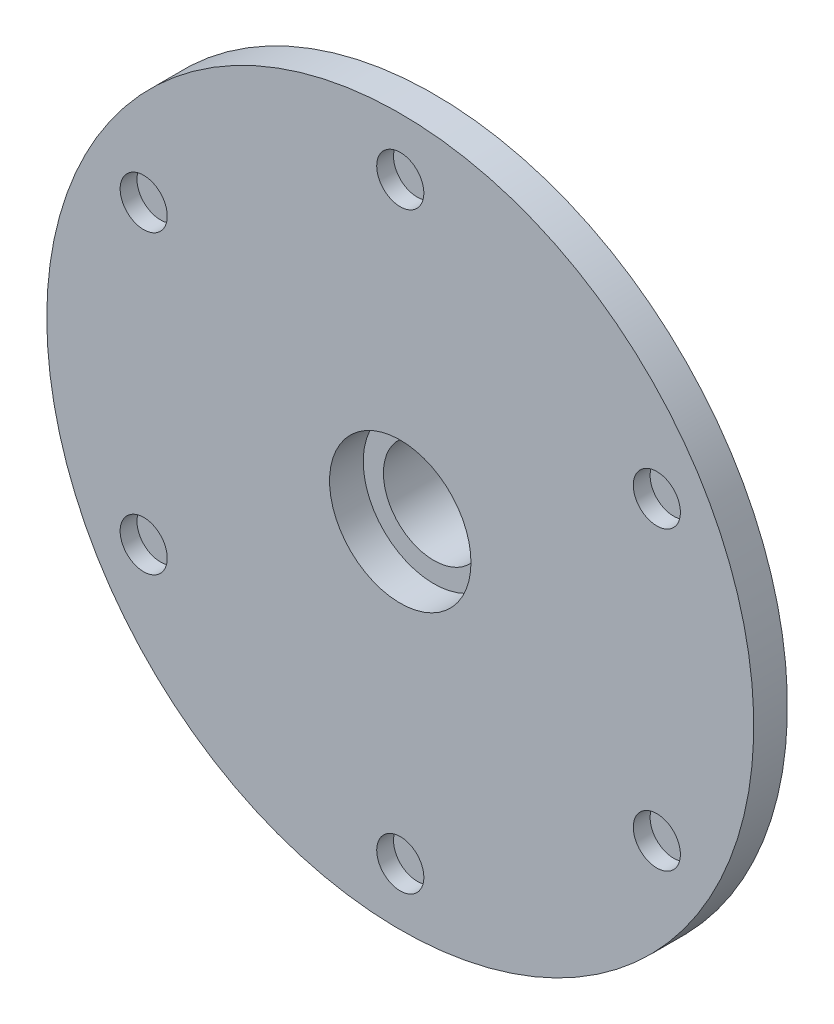
ISO-10303-21;
HEADER;
FILE_DESCRIPTION(('STEP AP214'),'2;1');
FILE_NAME('part.step','',(''),(''),'','','');
FILE_SCHEMA(('AUTOMOTIVE_DESIGN { 1 0 10303 214 1 1 1 1 }'));
ENDSEC;
DATA;
#1=APPLICATION_CONTEXT('core data for automotive mechanical design processes');
#2=APPLICATION_PROTOCOL_DEFINITION('international standard','automotive_design',2000,#1);
#3=PRODUCT_CONTEXT('',#1,'mechanical');
#4=PRODUCT('Part','Part','',(#3));
#5=PRODUCT_RELATED_PRODUCT_CATEGORY('part','',(#4));
#6=PRODUCT_DEFINITION_FORMATION('','',#4);
#7=PRODUCT_DEFINITION_CONTEXT('part definition',#1,'design');
#8=PRODUCT_DEFINITION('design','',#6,#7);
#9=PRODUCT_DEFINITION_SHAPE('','',#8);
#10=(LENGTH_UNIT() NAMED_UNIT(*) SI_UNIT(.MILLI.,.METRE.));
#11=(NAMED_UNIT(*) PLANE_ANGLE_UNIT() SI_UNIT($,.RADIAN.));
#12=(NAMED_UNIT(*) SI_UNIT($,.STERADIAN.) SOLID_ANGLE_UNIT());
#13=UNCERTAINTY_MEASURE_WITH_UNIT(LENGTH_MEASURE(1.E-05),#10,'distance_accuracy_value','');
#14=(GEOMETRIC_REPRESENTATION_CONTEXT(3) GLOBAL_UNCERTAINTY_ASSIGNED_CONTEXT((#13)) GLOBAL_UNIT_ASSIGNED_CONTEXT((#10,
#11,#12)) REPRESENTATION_CONTEXT('',''));
#15=CARTESIAN_POINT('',(0.,0.,0.));
#16=DIRECTION('',(0.,0.,1.));
#17=DIRECTION('',(1.,0.,0.));
#18=AXIS2_PLACEMENT_3D('',#15,#16,#17);
#19=CARTESIAN_POINT('',(0.,0.,13.));
#20=DIRECTION('',(0.,0.,-1.));
#21=DIRECTION('',(-1.,0.,0.));
#22=AXIS2_PLACEMENT_3D('',#19,#20,#21);
#23=CYLINDRICAL_SURFACE('',#22,7.5);
#24=CARTESIAN_POINT('',(0.,0.,-7.));
#25=DIRECTION('',(0.,0.,-1.));
#26=DIRECTION('',(-1.,0.,0.));
#27=AXIS2_PLACEMENT_3D('',#24,#25,#26);
#28=CIRCLE('',#27,7.5);
#29=CARTESIAN_POINT('',(-7.5,0.,-7.));
#30=VERTEX_POINT('',#29);
#31=EDGE_CURVE('E55',#30,#30,#28,.T.);
#32=ORIENTED_EDGE('',*,*,#31,.T.);
#33=EDGE_LOOP('',(#32));
#34=FACE_BOUND('',#33,.T.);
#35=CARTESIAN_POINT('',(0.,0.,8.));
#36=DIRECTION('',(0.,0.,1.));
#37=DIRECTION('',(1.,0.,0.));
#38=AXIS2_PLACEMENT_3D('',#35,#36,#37);
#39=CIRCLE('',#38,7.5);
#40=CARTESIAN_POINT('',(7.5,0.,8.));
#41=VERTEX_POINT('',#40);
#42=EDGE_CURVE('E35',#41,#41,#39,.F.);
#43=ORIENTED_EDGE('',*,*,#42,.F.);
#44=EDGE_LOOP('',(#43));
#45=FACE_BOUND('',#44,.T.);
#46=ADVANCED_FACE('F31',(#34,#45),#23,.F.);
#47=CARTESIAN_POINT('',(0.,0.,0.));
#48=DIRECTION('',(0.,0.,1.));
#49=DIRECTION('',(1.,0.,0.));
#50=AXIS2_PLACEMENT_3D('',#47,#48,#49);
#51=PLANE('',#50);
#52=CARTESIAN_POINT('',(0.,0.,0.));
#53=DIRECTION('',(0.,0.,-1.));
#54=DIRECTION('',(-1.,0.,0.));
#55=AXIS2_PLACEMENT_3D('',#52,#53,#54);
#56=CIRCLE('',#55,17.5);
#57=CARTESIAN_POINT('',(-17.5,0.,0.));
#58=VERTEX_POINT('',#57);
#59=EDGE_CURVE('E10',#58,#58,#56,.T.);
#60=ORIENTED_EDGE('',*,*,#59,.F.);
#61=EDGE_LOOP('',(#60));
#62=FACE_BOUND('',#61,.T.);
#63=CARTESIAN_POINT('',(0.,0.,0.));
#64=DIRECTION('',(0.,0.,-1.));
#65=DIRECTION('',(-1.,0.,0.));
#66=AXIS2_PLACEMENT_3D('',#63,#64,#65);
#67=CIRCLE('',#66,25.);
#68=CARTESIAN_POINT('',(-25.,0.,0.));
#69=VERTEX_POINT('',#68);
#70=EDGE_CURVE('E52',#69,#69,#67,.T.);
#71=ORIENTED_EDGE('',*,*,#70,.T.);
#72=EDGE_LOOP('',(#71));
#73=FACE_BOUND('',#72,.T.);
#74=ADVANCED_FACE('F115',(#62,#73),#51,.F.);
#75=CARTESIAN_POINT('',(0.,0.,-7.));
#76=DIRECTION('',(0.,0.,1.));
#77=DIRECTION('',(1.,0.,0.));
#78=AXIS2_PLACEMENT_3D('',#75,#76,#77);
#79=CYLINDRICAL_SURFACE('',#78,17.5);
#80=CARTESIAN_POINT('',(0.,0.,-7.));
#81=DIRECTION('',(0.,0.,-1.));
#82=DIRECTION('',(-1.,0.,0.));
#83=AXIS2_PLACEMENT_3D('',#80,#81,#82);
#84=CIRCLE('',#83,17.5);
#85=CARTESIAN_POINT('',(-17.5,0.,-7.));
#86=VERTEX_POINT('',#85);
#87=EDGE_CURVE('E44',#86,#86,#84,.T.);
#88=ORIENTED_EDGE('',*,*,#87,.F.);
#89=EDGE_LOOP('',(#88));
#90=FACE_BOUND('',#89,.T.);
#91=ORIENTED_EDGE('',*,*,#59,.T.);
#92=EDGE_LOOP('',(#91));
#93=FACE_BOUND('',#92,.T.);
#94=ADVANCED_FACE('F121',(#90,#93),#79,.T.);
#95=CARTESIAN_POINT('',(0.,0.,-7.));
#96=DIRECTION('',(0.,0.,-1.));
#97=DIRECTION('',(-1.,0.,0.));
#98=AXIS2_PLACEMENT_3D('',#95,#96,#97);
#99=PLANE('',#98);
#100=ORIENTED_EDGE('',*,*,#31,.F.);
#101=EDGE_LOOP('',(#100));
#102=FACE_BOUND('',#101,.T.);
#103=ORIENTED_EDGE('',*,*,#87,.T.);
#104=EDGE_LOOP('',(#103));
#105=FACE_BOUND('',#104,.T.);
#106=ADVANCED_FACE('F136',(#102,#105),#99,.T.);
#107=CARTESIAN_POINT('',(0.,0.,8.));
#108=DIRECTION('',(0.,0.,-1.));
#109=DIRECTION('',(-1.,0.,0.));
#110=AXIS2_PLACEMENT_3D('',#107,#108,#109);
#111=PLANE('',#110);
#112=CARTESIAN_POINT('',(0.,0.,8.));
#113=DIRECTION('',(0.,0.,-1.));
#114=DIRECTION('',(-1.,0.,0.));
#115=AXIS2_PLACEMENT_3D('',#112,#113,#114);
#116=CIRCLE('',#115,25.);
#117=CARTESIAN_POINT('',(-25.,0.,8.));
#118=VERTEX_POINT('',#117);
#119=EDGE_CURVE('E51',#118,#118,#116,.T.);
#120=ORIENTED_EDGE('',*,*,#119,.F.);
#121=EDGE_LOOP('',(#120));
#122=FACE_BOUND('',#121,.T.);
#123=CARTESIAN_POINT('',(0.,0.,8.));
#124=DIRECTION('',(0.,0.,-1.));
#125=DIRECTION('',(-1.,0.,0.));
#126=AXIS2_PLACEMENT_3D('',#123,#124,#125);
#127=CIRCLE('',#126,52.5);
#128=CARTESIAN_POINT('',(-52.5,0.,8.));
#129=VERTEX_POINT('',#128);
#130=EDGE_CURVE('E48',#129,#129,#127,.T.);
#131=ORIENTED_EDGE('',*,*,#130,.T.);
#132=EDGE_LOOP('',(#131));
#133=FACE_BOUND('',#132,.T.);
#134=ADVANCED_FACE('F132',(#122,#133),#111,.T.);
#135=CARTESIAN_POINT('',(0.,0.,8.));
#136=DIRECTION('',(0.,0.,-1.));
#137=DIRECTION('',(-1.,0.,0.));
#138=AXIS2_PLACEMENT_3D('',#135,#136,#137);
#139=CYLINDRICAL_SURFACE('',#138,25.);
#140=ORIENTED_EDGE('',*,*,#119,.T.);
#141=EDGE_LOOP('',(#140));
#142=FACE_BOUND('',#141,.T.);
#143=ORIENTED_EDGE('',*,*,#70,.F.);
#144=EDGE_LOOP('',(#143));
#145=FACE_BOUND('',#144,.T.);
#146=ADVANCED_FACE('F128',(#142,#145),#139,.T.);
#147=CARTESIAN_POINT('',(0.,0.,13.));
#148=DIRECTION('',(0.,0.,1.));
#149=DIRECTION('',(1.,0.,0.));
#150=AXIS2_PLACEMENT_3D('',#147,#148,#149);
#151=PLANE('',#150);
#152=CARTESIAN_POINT('',(0.,44.,13.));
#153=DIRECTION('',(0.,0.,-1.));
#154=DIRECTION('',(-1.,0.,0.));
#155=AXIS2_PLACEMENT_3D('',#152,#153,#154);
#156=CIRCLE('',#155,3.5);
#157=CARTESIAN_POINT('',(-3.5,44.,13.));
#158=VERTEX_POINT('',#157);
#159=EDGE_CURVE('E92',#158,#158,#156,.T.);
#160=ORIENTED_EDGE('',*,*,#159,.T.);
#161=EDGE_LOOP('',(#160));
#162=FACE_BOUND('',#161,.T.);
#163=CARTESIAN_POINT('',(38.1051177665144,21.9999999999984,13.));
#164=DIRECTION('',(0.,0.,-1.));
#165=DIRECTION('',(-1.,0.,0.));
#166=AXIS2_PLACEMENT_3D('',#163,#164,#165);
#167=CIRCLE('',#166,3.5);
#168=CARTESIAN_POINT('',(34.6051177665144,21.9999999999984,13.));
#169=VERTEX_POINT('',#168);
#170=EDGE_CURVE('E93',#169,#169,#167,.T.);
#171=ORIENTED_EDGE('',*,*,#170,.T.);
#172=EDGE_LOOP('',(#171));
#173=FACE_BOUND('',#172,.T.);
#174=CARTESIAN_POINT('',(38.1051177665125,-22.0000000000016,13.));
#175=DIRECTION('',(0.,0.,-1.));
#176=DIRECTION('',(-1.,0.,0.));
#177=AXIS2_PLACEMENT_3D('',#174,#175,#176);
#178=CIRCLE('',#177,3.5);
#179=CARTESIAN_POINT('',(34.6051177665125,-22.0000000000016,13.));
#180=VERTEX_POINT('',#179);
#181=EDGE_CURVE('E67',#180,#180,#178,.T.);
#182=ORIENTED_EDGE('',*,*,#181,.T.);
#183=EDGE_LOOP('',(#182));
#184=FACE_BOUND('',#183,.T.);
#185=CARTESIAN_POINT('',(-3.74088875298083E-12,-44.,13.));
#186=DIRECTION('',(0.,0.,-1.));
#187=DIRECTION('',(-1.,0.,0.));
#188=AXIS2_PLACEMENT_3D('',#185,#186,#187);
#189=CIRCLE('',#188,3.5);
#190=CARTESIAN_POINT('',(-3.50000000000374,-44.,13.));
#191=VERTEX_POINT('',#190);
#192=EDGE_CURVE('E74',#191,#191,#189,.T.);
#193=ORIENTED_EDGE('',*,*,#192,.T.);
#194=EDGE_LOOP('',(#193));
#195=FACE_BOUND('',#194,.T.);
#196=CARTESIAN_POINT('',(-38.1051177665181,-21.9999999999984,13.));
#197=DIRECTION('',(0.,0.,-1.));
#198=DIRECTION('',(-1.,0.,0.));
#199=AXIS2_PLACEMENT_3D('',#196,#197,#198);
#200=CIRCLE('',#199,3.5);
#201=CARTESIAN_POINT('',(-41.6051177665181,-21.9999999999984,13.));
#202=VERTEX_POINT('',#201);
#203=EDGE_CURVE('E80',#202,#202,#200,.T.);
#204=ORIENTED_EDGE('',*,*,#203,.T.);
#205=EDGE_LOOP('',(#204));
#206=FACE_BOUND('',#205,.T.);
#207=CARTESIAN_POINT('',(-38.1051177665162,22.0000000000016,13.));
#208=DIRECTION('',(0.,0.,-1.));
#209=DIRECTION('',(-1.,0.,0.));
#210=AXIS2_PLACEMENT_3D('',#207,#208,#209);
#211=CIRCLE('',#210,3.5);
#212=CARTESIAN_POINT('',(-41.6051177665162,22.0000000000016,13.));
#213=VERTEX_POINT('',#212);
#214=EDGE_CURVE('E86',#213,#213,#211,.T.);
#215=ORIENTED_EDGE('',*,*,#214,.T.);
#216=EDGE_LOOP('',(#215));
#217=FACE_BOUND('',#216,.T.);
#218=CARTESIAN_POINT('',(0.,0.,13.));
#219=DIRECTION('',(0.,0.,1.));
#220=DIRECTION('',(1.,0.,0.));
#221=AXIS2_PLACEMENT_3D('',#218,#219,#220);
#222=CIRCLE('',#221,10.5);
#223=CARTESIAN_POINT('',(10.5,0.,13.));
#224=VERTEX_POINT('',#223);
#225=EDGE_CURVE('E60',#224,#224,#222,.T.);
#226=ORIENTED_EDGE('',*,*,#225,.F.);
#227=EDGE_LOOP('',(#226));
#228=FACE_BOUND('',#227,.T.);
#229=CARTESIAN_POINT('',(0.,0.,13.));
#230=DIRECTION('',(0.,0.,1.));
#231=DIRECTION('',(1.,0.,0.));
#232=AXIS2_PLACEMENT_3D('',#229,#230,#231);
#233=CIRCLE('',#232,52.5);
#234=CARTESIAN_POINT('',(-52.5,0.,13.));
#235=VERTEX_POINT('',#234);
#236=EDGE_CURVE('E39',#235,#235,#233,.T.);
#237=ORIENTED_EDGE('',*,*,#236,.T.);
#238=EDGE_LOOP('',(#237));
#239=FACE_BOUND('',#238,.T.);
#240=ADVANCED_FACE('F131',(#162,#173,#184,#195,#206,#217,#228,#239),#151,.T.);
#241=CARTESIAN_POINT('',(0.,0.,13.));
#242=DIRECTION('',(0.,0.,-1.));
#243=DIRECTION('',(-1.,0.,0.));
#244=AXIS2_PLACEMENT_3D('',#241,#242,#243);
#245=CYLINDRICAL_SURFACE('',#244,52.5);
#246=CARTESIAN_POINT('',(-52.5,0.,13.));
#247=CARTESIAN_POINT('',(-52.5,0.,12.9479166666667));
#248=CARTESIAN_POINT('',(-52.5,0.,12.8958333333333));
#249=CARTESIAN_POINT('',(-52.5,0.,12.7916666666667));
#250=CARTESIAN_POINT('',(-52.5,0.,12.7395833333333));
#251=CARTESIAN_POINT('',(-52.5,0.,12.6354166666667));
#252=CARTESIAN_POINT('',(-52.5,0.,12.5833333333333));
#253=CARTESIAN_POINT('',(-52.5,0.,12.4791666666667));
#254=CARTESIAN_POINT('',(-52.5,0.,12.4270833333333));
#255=CARTESIAN_POINT('',(-52.5,0.,12.3229166666667));
#256=CARTESIAN_POINT('',(-52.5,0.,12.2708333333333));
#257=CARTESIAN_POINT('',(-52.5,0.,12.1666666666667));
#258=CARTESIAN_POINT('',(-52.5,0.,12.1145833333333));
#259=CARTESIAN_POINT('',(-52.5,0.,12.0104166666667));
#260=CARTESIAN_POINT('',(-52.5,0.,11.9583333333333));
#261=CARTESIAN_POINT('',(-52.5,0.,11.8541666666667));
#262=CARTESIAN_POINT('',(-52.5,0.,11.8020833333333));
#263=CARTESIAN_POINT('',(-52.5,0.,11.6979166666667));
#264=CARTESIAN_POINT('',(-52.5,0.,11.6458333333333));
#265=CARTESIAN_POINT('',(-52.5,0.,11.5416666666667));
#266=CARTESIAN_POINT('',(-52.5,0.,11.4895833333333));
#267=CARTESIAN_POINT('',(-52.5,0.,11.3854166666667));
#268=CARTESIAN_POINT('',(-52.5,0.,11.3333333333333));
#269=CARTESIAN_POINT('',(-52.5,0.,11.2291666666667));
#270=CARTESIAN_POINT('',(-52.5,0.,11.1770833333333));
#271=CARTESIAN_POINT('',(-52.5,0.,11.0729166666667));
#272=CARTESIAN_POINT('',(-52.5,0.,11.0208333333333));
#273=CARTESIAN_POINT('',(-52.5,0.,10.9166666666667));
#274=CARTESIAN_POINT('',(-52.5,0.,10.8645833333333));
#275=CARTESIAN_POINT('',(-52.5,0.,10.7604166666667));
#276=CARTESIAN_POINT('',(-52.5,0.,10.7083333333333));
#277=CARTESIAN_POINT('',(-52.5,0.,10.6041666666667));
#278=CARTESIAN_POINT('',(-52.5,0.,10.5520833333333));
#279=CARTESIAN_POINT('',(-52.5,0.,10.4479166666667));
#280=CARTESIAN_POINT('',(-52.5,0.,10.3958333333333));
#281=CARTESIAN_POINT('',(-52.5,0.,10.2916666666667));
#282=CARTESIAN_POINT('',(-52.5,0.,10.2395833333333));
#283=CARTESIAN_POINT('',(-52.5,0.,10.1354166666667));
#284=CARTESIAN_POINT('',(-52.5,0.,10.0833333333333));
#285=CARTESIAN_POINT('',(-52.5,0.,9.97916666666667));
#286=CARTESIAN_POINT('',(-52.5,0.,9.92708333333333));
#287=CARTESIAN_POINT('',(-52.5,0.,9.82291666666667));
#288=CARTESIAN_POINT('',(-52.5,0.,9.77083333333333));
#289=CARTESIAN_POINT('',(-52.5,0.,9.66666666666667));
#290=CARTESIAN_POINT('',(-52.5,0.,9.61458333333333));
#291=CARTESIAN_POINT('',(-52.5,0.,9.51041666666667));
#292=CARTESIAN_POINT('',(-52.5,0.,9.45833333333333));
#293=CARTESIAN_POINT('',(-52.5,0.,9.35416666666667));
#294=CARTESIAN_POINT('',(-52.5,0.,9.30208333333333));
#295=CARTESIAN_POINT('',(-52.5,0.,9.19791666666667));
#296=CARTESIAN_POINT('',(-52.5,0.,9.14583333333333));
#297=CARTESIAN_POINT('',(-52.5,0.,9.04166666666667));
#298=CARTESIAN_POINT('',(-52.5,0.,8.98958333333333));
#299=CARTESIAN_POINT('',(-52.5,0.,8.88541666666667));
#300=CARTESIAN_POINT('',(-52.5,0.,8.83333333333333));
#301=CARTESIAN_POINT('',(-52.5,0.,8.72916666666667));
#302=CARTESIAN_POINT('',(-52.5,0.,8.67708333333333));
#303=CARTESIAN_POINT('',(-52.5,0.,8.57291666666667));
#304=CARTESIAN_POINT('',(-52.5,0.,8.52083333333333));
#305=CARTESIAN_POINT('',(-52.5,0.,8.41666666666667));
#306=CARTESIAN_POINT('',(-52.5,0.,8.36458333333333));
#307=CARTESIAN_POINT('',(-52.5,0.,8.26041666666667));
#308=CARTESIAN_POINT('',(-52.5,0.,8.20833333333333));
#309=CARTESIAN_POINT('',(-52.5,0.,8.10416666666667));
#310=CARTESIAN_POINT('',(-52.5,0.,8.05208333333333));
#311=CARTESIAN_POINT('',(-52.5,0.,8.));
#312=B_SPLINE_CURVE_WITH_KNOTS('',3,(#246,#247,#248,#249,#250,#251,#252,#253,#254,#255,#256,
#257,#258,#259,#260,#261,#262,#263,#264,#265,#266,#267,#268,#269,#270,#271,#272,#273,#274,#275,
#276,#277,#278,#279,#280,#281,#282,#283,#284,#285,#286,#287,#288,#289,#290,#291,#292,#293,#294,
#295,#296,#297,#298,#299,#300,#301,#302,#303,#304,#305,#306,#307,#308,#309,#310,#311),
.UNSPECIFIED.,.F.,.F.,(4,2,2,2,2,2,2,2,2,2,2,2,2,2,2,2,2,2,2,2,2,2,2,2,2,2,2,2,2,2,2,2,4),(0.,
0.15625,0.3125,0.46875,0.625000000000001,0.781250000000001,0.937500000000001,1.09375,1.25,
1.40625,1.5625,1.71875,1.875,2.03125,2.1875,2.34375,2.5,2.65625,2.8125,2.96875,3.125,3.28125,
3.4375,3.59375,3.75,3.90625,4.0625,4.21875,4.375,4.53125,4.6875,4.84375,5.),.UNSPECIFIED.);
#313=EDGE_CURVE('BSEAM33',#235,#129,#312,.T.);
#314=ORIENTED_EDGE('',*,*,#236,.F.);
#315=ORIENTED_EDGE('',*,*,#130,.F.);
#316=ORIENTED_EDGE('',*,*,#313,.T.);
#317=ORIENTED_EDGE('',*,*,#313,.F.);
#318=EDGE_LOOP('',(#314,#316,#315,#317));
#319=FACE_BOUND('',#318,.T.);
#320=ADVANCED_FACE('F33',(#319),#245,.T.);
#321=CARTESIAN_POINT('',(0.,0.,8.));
#322=DIRECTION('',(0.,0.,1.));
#323=DIRECTION('',(1.,0.,0.));
#324=AXIS2_PLACEMENT_3D('',#321,#322,#323);
#325=PLANE('',#324);
#326=CARTESIAN_POINT('',(0.,0.,8.));
#327=DIRECTION('',(0.,0.,1.));
#328=DIRECTION('',(1.,0.,0.));
#329=AXIS2_PLACEMENT_3D('',#326,#327,#328);
#330=CIRCLE('',#329,10.5);
#331=CARTESIAN_POINT('',(10.5,0.,8.));
#332=VERTEX_POINT('',#331);
#333=EDGE_CURVE('E63',#332,#332,#330,.T.);
#334=ORIENTED_EDGE('',*,*,#333,.T.);
#335=EDGE_LOOP('',(#334));
#336=FACE_BOUND('',#335,.T.);
#337=ORIENTED_EDGE('',*,*,#42,.T.);
#338=EDGE_LOOP('',(#337));
#339=FACE_BOUND('',#338,.T.);
#340=ADVANCED_FACE('F149',(#336,#339),#325,.T.);
#341=CARTESIAN_POINT('',(0.,0.,8.));
#342=DIRECTION('',(0.,0.,1.));
#343=DIRECTION('',(1.,0.,0.));
#344=AXIS2_PLACEMENT_3D('',#341,#342,#343);
#345=CYLINDRICAL_SURFACE('',#344,10.5);
#346=ORIENTED_EDGE('',*,*,#333,.F.);
#347=EDGE_LOOP('',(#346));
#348=FACE_BOUND('',#347,.T.);
#349=ORIENTED_EDGE('',*,*,#225,.T.);
#350=EDGE_LOOP('',(#349));
#351=FACE_BOUND('',#350,.T.);
#352=ADVANCED_FACE('F126',(#348,#351),#345,.F.);
#353=CARTESIAN_POINT('',(-38.1051177665162,22.0000000000016,10.5));
#354=DIRECTION('',(0.,0.,1.));
#355=DIRECTION('',(1.,0.,0.));
#356=AXIS2_PLACEMENT_3D('',#353,#354,#355);
#357=CYLINDRICAL_SURFACE('',#356,3.5);
#358=CARTESIAN_POINT('',(-38.1051177665162,22.0000000000016,10.5));
#359=DIRECTION('',(0.,0.,-1.));
#360=DIRECTION('',(-1.,0.,0.));
#361=AXIS2_PLACEMENT_3D('',#358,#359,#360);
#362=CIRCLE('',#361,3.5);
#363=CARTESIAN_POINT('',(-41.6051177665162,22.0000000000016,10.5));
#364=VERTEX_POINT('',#363);
#365=EDGE_CURVE('E89',#364,#364,#362,.T.);
#366=ORIENTED_EDGE('',*,*,#365,.T.);
#367=EDGE_LOOP('',(#366));
#368=FACE_BOUND('',#367,.T.);
#369=ORIENTED_EDGE('',*,*,#214,.F.);
#370=EDGE_LOOP('',(#369));
#371=FACE_BOUND('',#370,.T.);
#372=ADVANCED_FACE('F171',(#368,#371),#357,.F.);
#373=CARTESIAN_POINT('',(-38.1051177665162,22.0000000000016,10.5));
#374=DIRECTION('',(0.,0.,-1.));
#375=DIRECTION('',(-1.,0.,0.));
#376=AXIS2_PLACEMENT_3D('',#373,#374,#375);
#377=PLANE('',#376);
#378=ORIENTED_EDGE('',*,*,#365,.F.);
#379=EDGE_LOOP('',(#378));
#380=FACE_BOUND('',#379,.T.);
#381=ADVANCED_FACE('F177',(#380),#377,.F.);
#382=CARTESIAN_POINT('',(-38.1051177665181,-21.9999999999984,10.5));
#383=DIRECTION('',(0.,0.,1.));
#384=DIRECTION('',(1.,0.,0.));
#385=AXIS2_PLACEMENT_3D('',#382,#383,#384);
#386=CYLINDRICAL_SURFACE('',#385,3.5);
#387=CARTESIAN_POINT('',(-38.1051177665181,-21.9999999999984,10.5));
#388=DIRECTION('',(0.,0.,-1.));
#389=DIRECTION('',(-1.,0.,0.));
#390=AXIS2_PLACEMENT_3D('',#387,#388,#389);
#391=CIRCLE('',#390,3.5);
#392=CARTESIAN_POINT('',(-41.6051177665181,-21.9999999999984,10.5));
#393=VERTEX_POINT('',#392);
#394=EDGE_CURVE('E83',#393,#393,#391,.T.);
#395=ORIENTED_EDGE('',*,*,#394,.T.);
#396=EDGE_LOOP('',(#395));
#397=FACE_BOUND('',#396,.T.);
#398=ORIENTED_EDGE('',*,*,#203,.F.);
#399=EDGE_LOOP('',(#398));
#400=FACE_BOUND('',#399,.T.);
#401=ADVANCED_FACE('F206',(#397,#400),#386,.F.);
#402=CARTESIAN_POINT('',(-38.1051177665181,-21.9999999999984,10.5));
#403=DIRECTION('',(0.,0.,-1.));
#404=DIRECTION('',(-1.,0.,0.));
#405=AXIS2_PLACEMENT_3D('',#402,#403,#404);
#406=PLANE('',#405);
#407=ORIENTED_EDGE('',*,*,#394,.F.);
#408=EDGE_LOOP('',(#407));
#409=FACE_BOUND('',#408,.T.);
#410=ADVANCED_FACE('F201',(#409),#406,.F.);
#411=CARTESIAN_POINT('',(-3.74088875298083E-12,-44.,10.5));
#412=DIRECTION('',(0.,0.,1.));
#413=DIRECTION('',(1.,0.,0.));
#414=AXIS2_PLACEMENT_3D('',#411,#412,#413);
#415=CYLINDRICAL_SURFACE('',#414,3.5);
#416=CARTESIAN_POINT('',(-3.74088875298083E-12,-44.,10.5));
#417=DIRECTION('',(0.,0.,-1.));
#418=DIRECTION('',(-1.,0.,0.));
#419=AXIS2_PLACEMENT_3D('',#416,#417,#418);
#420=CIRCLE('',#419,3.5);
#421=CARTESIAN_POINT('',(-3.50000000000374,-44.,10.5));
#422=VERTEX_POINT('',#421);
#423=EDGE_CURVE('E77',#422,#422,#420,.T.);
#424=ORIENTED_EDGE('',*,*,#423,.T.);
#425=EDGE_LOOP('',(#424));
#426=FACE_BOUND('',#425,.T.);
#427=ORIENTED_EDGE('',*,*,#192,.F.);
#428=EDGE_LOOP('',(#427));
#429=FACE_BOUND('',#428,.T.);
#430=ADVANCED_FACE('F198',(#426,#429),#415,.F.);
#431=CARTESIAN_POINT('',(-3.74088875298083E-12,-44.,10.5));
#432=DIRECTION('',(0.,0.,-1.));
#433=DIRECTION('',(-1.,0.,0.));
#434=AXIS2_PLACEMENT_3D('',#431,#432,#433);
#435=PLANE('',#434);
#436=ORIENTED_EDGE('',*,*,#423,.F.);
#437=EDGE_LOOP('',(#436));
#438=FACE_BOUND('',#437,.T.);
#439=ADVANCED_FACE('F192',(#438),#435,.F.);
#440=CARTESIAN_POINT('',(38.1051177665125,-22.0000000000016,10.5));
#441=DIRECTION('',(0.,0.,1.));
#442=DIRECTION('',(1.,0.,0.));
#443=AXIS2_PLACEMENT_3D('',#440,#441,#442);
#444=CYLINDRICAL_SURFACE('',#443,3.5);
#445=CARTESIAN_POINT('',(38.1051177665125,-22.0000000000016,10.5));
#446=DIRECTION('',(0.,0.,-1.));
#447=DIRECTION('',(-1.,0.,0.));
#448=AXIS2_PLACEMENT_3D('',#445,#446,#447);
#449=CIRCLE('',#448,3.5);
#450=CARTESIAN_POINT('',(34.6051177665125,-22.0000000000016,10.5));
#451=VERTEX_POINT('',#450);
#452=EDGE_CURVE('E70',#451,#451,#449,.T.);
#453=ORIENTED_EDGE('',*,*,#452,.T.);
#454=EDGE_LOOP('',(#453));
#455=FACE_BOUND('',#454,.T.);
#456=ORIENTED_EDGE('',*,*,#181,.F.);
#457=EDGE_LOOP('',(#456));
#458=FACE_BOUND('',#457,.T.);
#459=ADVANCED_FACE('F188',(#455,#458),#444,.F.);
#460=CARTESIAN_POINT('',(38.1051177665125,-22.0000000000016,10.5));
#461=DIRECTION('',(0.,0.,-1.));
#462=DIRECTION('',(-1.,0.,0.));
#463=AXIS2_PLACEMENT_3D('',#460,#461,#462);
#464=PLANE('',#463);
#465=ORIENTED_EDGE('',*,*,#452,.F.);
#466=EDGE_LOOP('',(#465));
#467=FACE_BOUND('',#466,.T.);
#468=ADVANCED_FACE('F191',(#467),#464,.F.);
#469=CARTESIAN_POINT('',(38.1051177665144,21.9999999999984,10.5));
#470=DIRECTION('',(0.,0.,1.));
#471=DIRECTION('',(1.,0.,0.));
#472=AXIS2_PLACEMENT_3D('',#469,#470,#471);
#473=CYLINDRICAL_SURFACE('',#472,3.5);
#474=CARTESIAN_POINT('',(38.1051177665144,21.9999999999984,10.5));
#475=DIRECTION('',(0.,0.,-1.));
#476=DIRECTION('',(-1.,0.,0.));
#477=AXIS2_PLACEMENT_3D('',#474,#475,#476);
#478=CIRCLE('',#477,3.5);
#479=CARTESIAN_POINT('',(34.6051177665144,21.9999999999984,10.5));
#480=VERTEX_POINT('',#479);
#481=EDGE_CURVE('E71',#480,#480,#478,.T.);
#482=ORIENTED_EDGE('',*,*,#481,.T.);
#483=EDGE_LOOP('',(#482));
#484=FACE_BOUND('',#483,.T.);
#485=ORIENTED_EDGE('',*,*,#170,.F.);
#486=EDGE_LOOP('',(#485));
#487=FACE_BOUND('',#486,.T.);
#488=ADVANCED_FACE('F196',(#484,#487),#473,.F.);
#489=CARTESIAN_POINT('',(38.1051177665144,21.9999999999984,10.5));
#490=DIRECTION('',(0.,0.,-1.));
#491=DIRECTION('',(-1.,0.,0.));
#492=AXIS2_PLACEMENT_3D('',#489,#490,#491);
#493=PLANE('',#492);
#494=ORIENTED_EDGE('',*,*,#481,.F.);
#495=EDGE_LOOP('',(#494));
#496=FACE_BOUND('',#495,.T.);
#497=ADVANCED_FACE('F112',(#496),#493,.F.);
#498=CARTESIAN_POINT('',(0.,44.,10.5));
#499=DIRECTION('',(0.,0.,1.));
#500=DIRECTION('',(1.,0.,0.));
#501=AXIS2_PLACEMENT_3D('',#498,#499,#500);
#502=CYLINDRICAL_SURFACE('',#501,3.5);
#503=CARTESIAN_POINT('',(0.,44.,10.5));
#504=DIRECTION('',(0.,0.,-1.));
#505=DIRECTION('',(-1.,0.,0.));
#506=AXIS2_PLACEMENT_3D('',#503,#504,#505);
#507=CIRCLE('',#506,3.5);
#508=CARTESIAN_POINT('',(-3.5,44.,10.5));
#509=VERTEX_POINT('',#508);
#510=EDGE_CURVE('E64',#509,#509,#507,.T.);
#511=ORIENTED_EDGE('',*,*,#510,.T.);
#512=EDGE_LOOP('',(#511));
#513=FACE_BOUND('',#512,.T.);
#514=ORIENTED_EDGE('',*,*,#159,.F.);
#515=EDGE_LOOP('',(#514));
#516=FACE_BOUND('',#515,.T.);
#517=ADVANCED_FACE('F103',(#513,#516),#502,.F.);
#518=CARTESIAN_POINT('',(0.,44.,10.5));
#519=DIRECTION('',(0.,0.,-1.));
#520=DIRECTION('',(-1.,0.,0.));
#521=AXIS2_PLACEMENT_3D('',#518,#519,#520);
#522=PLANE('',#521);
#523=ORIENTED_EDGE('',*,*,#510,.F.);
#524=EDGE_LOOP('',(#523));
#525=FACE_BOUND('',#524,.T.);
#526=ADVANCED_FACE('F106',(#525),#522,.F.);
#527=CLOSED_SHELL('',(#46,#74,#94,#106,#134,#146,#240,#320,#340,#352,#372,#381,#401,#410,#430,
#439,#459,#468,#488,#497,#517,#526));
#528=MANIFOLD_SOLID_BREP('B2',#527);
#529=ADVANCED_BREP_SHAPE_REPRESENTATION('',(#18,#528),#14);
#530=SHAPE_DEFINITION_REPRESENTATION(#9,#529);
ENDSEC;
END-ISO-10303-21;
